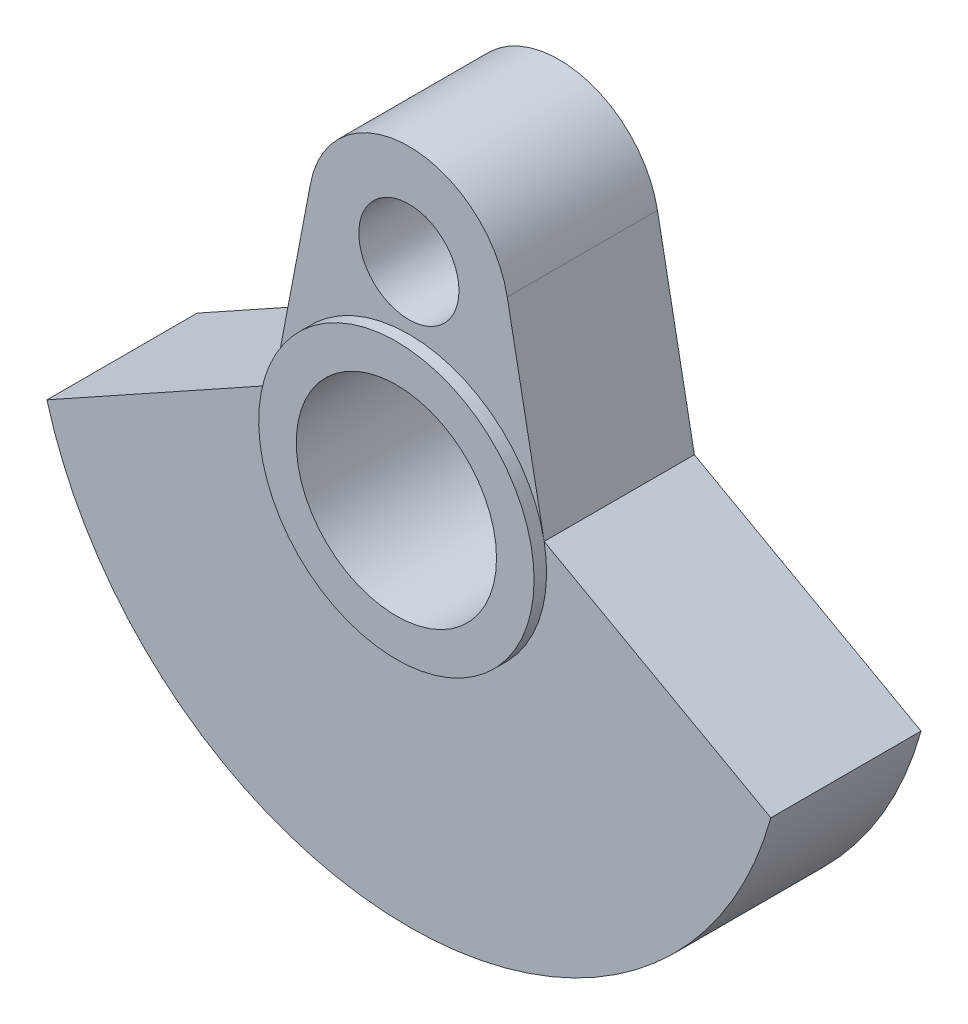
ISO-10303-21;
HEADER;
FILE_DESCRIPTION(('STEP AP214'),'2;1');
FILE_NAME('part.step','',(''),(''),'','','');
FILE_SCHEMA(('AUTOMOTIVE_DESIGN { 1 0 10303 214 1 1 1 1 }'));
ENDSEC;
DATA;
#1=APPLICATION_CONTEXT('core data for automotive mechanical design processes');
#2=APPLICATION_PROTOCOL_DEFINITION('international standard','automotive_design',2000,#1);
#3=PRODUCT_CONTEXT('',#1,'mechanical');
#4=PRODUCT('Part','Part','',(#3));
#5=PRODUCT_RELATED_PRODUCT_CATEGORY('part','',(#4));
#6=PRODUCT_DEFINITION_FORMATION('','',#4);
#7=PRODUCT_DEFINITION_CONTEXT('part definition',#1,'design');
#8=PRODUCT_DEFINITION('design','',#6,#7);
#9=PRODUCT_DEFINITION_SHAPE('','',#8);
#10=(LENGTH_UNIT() NAMED_UNIT(*) SI_UNIT(.MILLI.,.METRE.));
#11=(NAMED_UNIT(*) PLANE_ANGLE_UNIT() SI_UNIT($,.RADIAN.));
#12=(NAMED_UNIT(*) SI_UNIT($,.STERADIAN.) SOLID_ANGLE_UNIT());
#13=UNCERTAINTY_MEASURE_WITH_UNIT(LENGTH_MEASURE(1.E-05),#10,'distance_accuracy_value','');
#14=(GEOMETRIC_REPRESENTATION_CONTEXT(3) GLOBAL_UNCERTAINTY_ASSIGNED_CONTEXT((#13)) GLOBAL_UNIT_ASSIGNED_CONTEXT((#10,
#11,#12)) REPRESENTATION_CONTEXT('',''));
#15=CARTESIAN_POINT('',(0.,0.,0.));
#16=DIRECTION('',(0.,0.,1.));
#17=DIRECTION('',(1.,0.,0.));
#18=AXIS2_PLACEMENT_3D('',#15,#16,#17);
#19=CARTESIAN_POINT('',(0.,-8.,6.));
#20=DIRECTION('',(0.,0.,1.));
#21=DIRECTION('',(1.,0.,0.));
#22=AXIS2_PLACEMENT_3D('',#19,#20,#21);
#23=PLANE('',#22);
#24=CARTESIAN_POINT('',(0.,-8.,6.));
#25=DIRECTION('',(0.,0.,1.));
#26=DIRECTION('',(1.,0.,0.));
#27=AXIS2_PLACEMENT_3D('',#24,#25,#26);
#28=CIRCLE('',#27,5.5);
#29=CARTESIAN_POINT('',(5.40245531564121,-6.96875,6.));
#30=VERTEX_POINT('',#29);
#31=CARTESIAN_POINT('',(-5.40245531564121,-6.96875,6.));
#32=VERTEX_POINT('',#31);
#33=EDGE_CURVE('E54',#30,#32,#28,.T.);
#34=ORIENTED_EDGE('',*,*,#33,.F.);
#35=DIRECTION('',(-0.1875,0.982264602843857,0.));
#36=VECTOR('',#35,1.);
#37=CARTESIAN_POINT('',(5.40245531564121,-6.96875,6.));
#38=LINE('',#37,#36);
#39=CARTESIAN_POINT('',(3.92905841137543,0.75,6.));
#40=VERTEX_POINT('',#39);
#41=EDGE_CURVE('E116',#30,#40,#38,.T.);
#42=ORIENTED_EDGE('',*,*,#41,.T.);
#43=CARTESIAN_POINT('',(0.,0.,6.));
#44=DIRECTION('',(0.,0.,1.));
#45=DIRECTION('',(1.,0.,0.));
#46=AXIS2_PLACEMENT_3D('',#43,#44,#45);
#47=CIRCLE('',#46,4.);
#48=CARTESIAN_POINT('',(-3.92905841137543,0.75,6.));
#49=VERTEX_POINT('',#48);
#50=EDGE_CURVE('E109',#40,#49,#47,.T.);
#51=ORIENTED_EDGE('',*,*,#50,.T.);
#52=DIRECTION('',(-0.1875,-0.982264602843857,0.));
#53=VECTOR('',#52,1.);
#54=CARTESIAN_POINT('',(-5.40245531564121,-6.96875,6.));
#55=LINE('',#54,#53);
#56=EDGE_CURVE('E114',#49,#32,#55,.T.);
#57=ORIENTED_EDGE('',*,*,#56,.T.);
#58=EDGE_LOOP('',(#34,#42,#51,#57));
#59=FACE_BOUND('',#58,.T.);
#60=CARTESIAN_POINT('',(0.,0.,6.));
#61=DIRECTION('',(0.,0.,1.));
#62=DIRECTION('',(1.,0.,0.));
#63=AXIS2_PLACEMENT_3D('',#60,#61,#62);
#64=CIRCLE('',#63,2.);
#65=CARTESIAN_POINT('',(2.,0.,6.));
#66=VERTEX_POINT('',#65);
#67=EDGE_CURVE('E143',#66,#66,#64,.T.);
#68=ORIENTED_EDGE('',*,*,#67,.F.);
#69=EDGE_LOOP('',(#68));
#70=FACE_BOUND('',#69,.T.);
#71=ADVANCED_FACE('F42',(#59,#70),#23,.T.);
#72=EDGE_CURVE('E11',#32,#30,#28,.T.);
#73=ORIENTED_EDGE('',*,*,#72,.F.);
#74=DIRECTION('',(-0.874114625939399,-0.485719693567004,0.));
#75=VECTOR('',#74,1.);
#76=CARTESIAN_POINT('',(-5.40245531564121,-6.96875,6.));
#77=LINE('',#76,#75);
#78=CARTESIAN_POINT('',(-14.456832294801,-12.,6.));
#79=VERTEX_POINT('',#78);
#80=EDGE_CURVE('E62',#32,#79,#77,.T.);
#81=ORIENTED_EDGE('',*,*,#80,.T.);
#82=CARTESIAN_POINT('',(0.,-8.,6.));
#83=DIRECTION('',(0.,0.,1.));
#84=DIRECTION('',(1.,0.,0.));
#85=AXIS2_PLACEMENT_3D('',#82,#83,#84);
#86=CIRCLE('',#85,15.);
#87=CARTESIAN_POINT('',(14.456832294801,-12.,6.));
#88=VERTEX_POINT('',#87);
#89=EDGE_CURVE('E155',#79,#88,#86,.T.);
#90=ORIENTED_EDGE('',*,*,#89,.T.);
#91=DIRECTION('',(-0.874114625939399,0.485719693567004,0.));
#92=VECTOR('',#91,1.);
#93=CARTESIAN_POINT('',(5.40245531564121,-6.96875,6.));
#94=LINE('',#93,#92);
#95=EDGE_CURVE('E101',#88,#30,#94,.T.);
#96=ORIENTED_EDGE('',*,*,#95,.T.);
#97=EDGE_LOOP('',(#73,#81,#90,#96));
#98=FACE_BOUND('',#97,.T.);
#99=ADVANCED_FACE('F177',(#98),#23,.T.);
#100=CARTESIAN_POINT('',(0.,-8.,0.));
#101=DIRECTION('',(0.,0.,1.));
#102=DIRECTION('',(1.,0.,0.));
#103=AXIS2_PLACEMENT_3D('',#100,#101,#102);
#104=PLANE('',#103);
#105=CARTESIAN_POINT('',(0.,-8.,0.));
#106=DIRECTION('',(0.,0.,1.));
#107=DIRECTION('',(1.,0.,0.));
#108=AXIS2_PLACEMENT_3D('',#105,#106,#107);
#109=CIRCLE('',#108,15.);
#110=CARTESIAN_POINT('',(-14.456832294801,-12.,0.));
#111=VERTEX_POINT('',#110);
#112=CARTESIAN_POINT('',(14.456832294801,-12.,0.));
#113=VERTEX_POINT('',#112);
#114=EDGE_CURVE('E138',#111,#113,#109,.T.);
#115=ORIENTED_EDGE('',*,*,#114,.F.);
#116=DIRECTION('',(-0.874114625939399,-0.485719693567004,0.));
#117=VECTOR('',#116,1.);
#118=CARTESIAN_POINT('',(-5.40245531564121,-6.96875,0.));
#119=LINE('',#118,#117);
#120=CARTESIAN_POINT('',(-5.40245531564121,-6.96875,0.));
#121=VERTEX_POINT('',#120);
#122=EDGE_CURVE('E92',#121,#111,#119,.T.);
#123=ORIENTED_EDGE('',*,*,#122,.F.);
#124=DIRECTION('',(-0.1875,-0.982264602843857,0.));
#125=VECTOR('',#124,1.);
#126=CARTESIAN_POINT('',(-5.40245531564121,-6.96875,0.));
#127=LINE('',#126,#125);
#128=CARTESIAN_POINT('',(-3.92905841137543,0.75,0.));
#129=VERTEX_POINT('',#128);
#130=EDGE_CURVE('E86',#129,#121,#127,.T.);
#131=ORIENTED_EDGE('',*,*,#130,.F.);
#132=CARTESIAN_POINT('',(0.,0.,0.));
#133=DIRECTION('',(0.,0.,1.));
#134=DIRECTION('',(1.,0.,0.));
#135=AXIS2_PLACEMENT_3D('',#132,#133,#134);
#136=CIRCLE('',#135,4.);
#137=CARTESIAN_POINT('',(3.92905841137543,0.75,0.));
#138=VERTEX_POINT('',#137);
#139=EDGE_CURVE('E125',#138,#129,#136,.T.);
#140=ORIENTED_EDGE('',*,*,#139,.F.);
#141=DIRECTION('',(-0.1875,0.982264602843857,0.));
#142=VECTOR('',#141,1.);
#143=CARTESIAN_POINT('',(5.40245531564121,-6.96875,0.));
#144=LINE('',#143,#142);
#145=CARTESIAN_POINT('',(5.40245531564121,-6.96875,0.));
#146=VERTEX_POINT('',#145);
#147=EDGE_CURVE('E146',#146,#138,#144,.T.);
#148=ORIENTED_EDGE('',*,*,#147,.F.);
#149=DIRECTION('',(-0.874114625939399,0.485719693567004,0.));
#150=VECTOR('',#149,1.);
#151=CARTESIAN_POINT('',(5.40245531564121,-6.96875,0.));
#152=LINE('',#151,#150);
#153=EDGE_CURVE('E142',#113,#146,#152,.T.);
#154=ORIENTED_EDGE('',*,*,#153,.F.);
#155=EDGE_LOOP('',(#115,#123,#131,#140,#148,#154));
#156=FACE_BOUND('',#155,.T.);
#157=CARTESIAN_POINT('',(0.,0.,0.));
#158=DIRECTION('',(0.,0.,1.));
#159=DIRECTION('',(1.,0.,0.));
#160=AXIS2_PLACEMENT_3D('',#157,#158,#159);
#161=CIRCLE('',#160,2.);
#162=CARTESIAN_POINT('',(2.,0.,0.));
#163=VERTEX_POINT('',#162);
#164=EDGE_CURVE('E329',#163,#163,#161,.T.);
#165=ORIENTED_EDGE('',*,*,#164,.T.);
#166=EDGE_LOOP('',(#165));
#167=FACE_BOUND('',#166,.T.);
#168=CARTESIAN_POINT('',(0.,-8.,0.));
#169=DIRECTION('',(0.,0.,1.));
#170=DIRECTION('',(1.,0.,0.));
#171=AXIS2_PLACEMENT_3D('',#168,#169,#170);
#172=CIRCLE('',#171,4.);
#173=CARTESIAN_POINT('',(4.,-8.,0.));
#174=VERTEX_POINT('',#173);
#175=EDGE_CURVE('E331',#174,#174,#172,.T.);
#176=ORIENTED_EDGE('',*,*,#175,.T.);
#177=EDGE_LOOP('',(#176));
#178=FACE_BOUND('',#177,.T.);
#179=ADVANCED_FACE('F173',(#156,#167,#178),#104,.F.);
#180=CARTESIAN_POINT('',(0.,-8.,6.));
#181=DIRECTION('',(0.,0.,-1.));
#182=DIRECTION('',(-1.,0.,0.));
#183=AXIS2_PLACEMENT_3D('',#180,#181,#182);
#184=CYLINDRICAL_SURFACE('',#183,15.);
#185=ORIENTED_EDGE('',*,*,#114,.T.);
#186=DIRECTION('',(0.,0.,-1.));
#187=VECTOR('',#186,1.);
#188=CARTESIAN_POINT('',(14.456832294801,-12.,6.));
#189=LINE('',#188,#187);
#190=EDGE_CURVE('E46',#88,#113,#189,.T.);
#191=ORIENTED_EDGE('',*,*,#190,.F.);
#192=ORIENTED_EDGE('',*,*,#89,.F.);
#193=DIRECTION('',(0.,0.,-1.));
#194=VECTOR('',#193,1.);
#195=CARTESIAN_POINT('',(-14.456832294801,-12.,6.));
#196=LINE('',#195,#194);
#197=EDGE_CURVE('E134',#79,#111,#196,.T.);
#198=ORIENTED_EDGE('',*,*,#197,.T.);
#199=EDGE_LOOP('',(#185,#191,#192,#198));
#200=FACE_BOUND('',#199,.T.);
#201=ADVANCED_FACE('F44',(#200),#184,.T.);
#202=CARTESIAN_POINT('',(5.40245531564121,-6.96875,6.));
#203=DIRECTION('',(-0.485719693567004,-0.874114625939399,0.));
#204=DIRECTION('',(0.874114625939399,-0.485719693567004,0.));
#205=AXIS2_PLACEMENT_3D('',#202,#203,#204);
#206=PLANE('',#205);
#207=ORIENTED_EDGE('',*,*,#153,.T.);
#208=DIRECTION('',(0.,0.,-1.));
#209=VECTOR('',#208,1.);
#210=CARTESIAN_POINT('',(5.40245531564121,-6.96875,6.));
#211=LINE('',#210,#209);
#212=EDGE_CURVE('E161',#30,#146,#211,.T.);
#213=ORIENTED_EDGE('',*,*,#212,.F.);
#214=ORIENTED_EDGE('',*,*,#95,.F.);
#215=ORIENTED_EDGE('',*,*,#190,.T.);
#216=EDGE_LOOP('',(#207,#213,#214,#215));
#217=FACE_BOUND('',#216,.T.);
#218=ADVANCED_FACE('F168',(#217),#206,.F.);
#219=CARTESIAN_POINT('',(5.40245531564121,-6.96875,6.));
#220=DIRECTION('',(-0.982264602843857,-0.1875,0.));
#221=DIRECTION('',(0.1875,-0.982264602843857,0.));
#222=AXIS2_PLACEMENT_3D('',#219,#220,#221);
#223=PLANE('',#222);
#224=ORIENTED_EDGE('',*,*,#147,.T.);
#225=DIRECTION('',(0.,0.,-1.));
#226=VECTOR('',#225,1.);
#227=CARTESIAN_POINT('',(3.92905841137543,0.75,6.));
#228=LINE('',#227,#226);
#229=EDGE_CURVE('E127',#40,#138,#228,.T.);
#230=ORIENTED_EDGE('',*,*,#229,.F.);
#231=ORIENTED_EDGE('',*,*,#41,.F.);
#232=ORIENTED_EDGE('',*,*,#212,.T.);
#233=EDGE_LOOP('',(#224,#230,#231,#232));
#234=FACE_BOUND('',#233,.T.);
#235=ADVANCED_FACE('F175',(#234),#223,.F.);
#236=CARTESIAN_POINT('',(0.,0.,6.));
#237=DIRECTION('',(0.,0.,-1.));
#238=DIRECTION('',(-1.,0.,0.));
#239=AXIS2_PLACEMENT_3D('',#236,#237,#238);
#240=CYLINDRICAL_SURFACE('',#239,4.);
#241=ORIENTED_EDGE('',*,*,#139,.T.);
#242=DIRECTION('',(0.,0.,-1.));
#243=VECTOR('',#242,1.);
#244=CARTESIAN_POINT('',(-3.92905841137543,0.75,6.));
#245=LINE('',#244,#243);
#246=EDGE_CURVE('E122',#49,#129,#245,.T.);
#247=ORIENTED_EDGE('',*,*,#246,.F.);
#248=ORIENTED_EDGE('',*,*,#50,.F.);
#249=ORIENTED_EDGE('',*,*,#229,.T.);
#250=EDGE_LOOP('',(#241,#247,#248,#249));
#251=FACE_BOUND('',#250,.T.);
#252=ADVANCED_FACE('F123',(#251),#240,.T.);
#253=CARTESIAN_POINT('',(-5.40245531564121,-6.96875,6.));
#254=DIRECTION('',(0.982264602843857,-0.1875,0.));
#255=DIRECTION('',(0.1875,0.982264602843857,0.));
#256=AXIS2_PLACEMENT_3D('',#253,#254,#255);
#257=PLANE('',#256);
#258=ORIENTED_EDGE('',*,*,#130,.T.);
#259=DIRECTION('',(0.,0.,-1.));
#260=VECTOR('',#259,1.);
#261=CARTESIAN_POINT('',(-5.40245531564121,-6.96875,6.));
#262=LINE('',#261,#260);
#263=EDGE_CURVE('E128',#32,#121,#262,.T.);
#264=ORIENTED_EDGE('',*,*,#263,.F.);
#265=ORIENTED_EDGE('',*,*,#56,.F.);
#266=ORIENTED_EDGE('',*,*,#246,.T.);
#267=EDGE_LOOP('',(#258,#264,#265,#266));
#268=FACE_BOUND('',#267,.T.);
#269=ADVANCED_FACE('F130',(#268),#257,.F.);
#270=CARTESIAN_POINT('',(-5.40245531564121,-6.96875,6.));
#271=DIRECTION('',(0.485719693567004,-0.874114625939399,0.));
#272=DIRECTION('',(0.874114625939399,0.485719693567004,0.));
#273=AXIS2_PLACEMENT_3D('',#270,#271,#272);
#274=PLANE('',#273);
#275=ORIENTED_EDGE('',*,*,#122,.T.);
#276=ORIENTED_EDGE('',*,*,#197,.F.);
#277=ORIENTED_EDGE('',*,*,#80,.F.);
#278=ORIENTED_EDGE('',*,*,#263,.T.);
#279=EDGE_LOOP('',(#275,#276,#277,#278));
#280=FACE_BOUND('',#279,.T.);
#281=ADVANCED_FACE('F208',(#280),#274,.F.);
#282=CARTESIAN_POINT('',(0.,0.,6.));
#283=DIRECTION('',(0.,0.,-1.));
#284=DIRECTION('',(-1.,0.,0.));
#285=AXIS2_PLACEMENT_3D('',#282,#283,#284);
#286=CYLINDRICAL_SURFACE('',#285,2.);
#287=ORIENTED_EDGE('',*,*,#67,.T.);
#288=EDGE_LOOP('',(#287));
#289=FACE_BOUND('',#288,.T.);
#290=ORIENTED_EDGE('',*,*,#164,.F.);
#291=EDGE_LOOP('',(#290));
#292=FACE_BOUND('',#291,.T.);
#293=ADVANCED_FACE('F205',(#289,#292),#286,.F.);
#294=CARTESIAN_POINT('',(0.,-8.,6.));
#295=DIRECTION('',(0.,0.,-1.));
#296=DIRECTION('',(-1.,0.,0.));
#297=AXIS2_PLACEMENT_3D('',#294,#295,#296);
#298=CYLINDRICAL_SURFACE('',#297,4.);
#299=ORIENTED_EDGE('',*,*,#175,.F.);
#300=EDGE_LOOP('',(#299));
#301=FACE_BOUND('',#300,.T.);
#302=CARTESIAN_POINT('',(0.,-8.,6.5));
#303=DIRECTION('',(0.,0.,1.));
#304=DIRECTION('',(1.,0.,0.));
#305=AXIS2_PLACEMENT_3D('',#302,#303,#304);
#306=CIRCLE('',#305,4.);
#307=CARTESIAN_POINT('',(4.,-8.,6.5));
#308=VERTEX_POINT('',#307);
#309=EDGE_CURVE('E184',#308,#308,#306,.T.);
#310=ORIENTED_EDGE('',*,*,#309,.T.);
#311=EDGE_LOOP('',(#310));
#312=FACE_BOUND('',#311,.T.);
#313=ADVANCED_FACE('F193',(#301,#312),#298,.F.);
#314=CARTESIAN_POINT('',(0.,-8.,6.5));
#315=DIRECTION('',(0.,0.,1.));
#316=DIRECTION('',(1.,0.,0.));
#317=AXIS2_PLACEMENT_3D('',#314,#315,#316);
#318=PLANE('',#317);
#319=ORIENTED_EDGE('',*,*,#309,.F.);
#320=EDGE_LOOP('',(#319));
#321=FACE_BOUND('',#320,.T.);
#322=CARTESIAN_POINT('',(0.,-8.,6.5));
#323=DIRECTION('',(0.,0.,1.));
#324=DIRECTION('',(1.,0.,0.));
#325=AXIS2_PLACEMENT_3D('',#322,#323,#324);
#326=CIRCLE('',#325,5.5);
#327=CARTESIAN_POINT('',(5.5,-8.,6.5));
#328=VERTEX_POINT('',#327);
#329=EDGE_CURVE('E183',#328,#328,#326,.T.);
#330=ORIENTED_EDGE('',*,*,#329,.T.);
#331=EDGE_LOOP('',(#330));
#332=FACE_BOUND('',#331,.T.);
#333=ADVANCED_FACE('F187',(#321,#332),#318,.T.);
#334=CARTESIAN_POINT('',(0.,-8.,6.5));
#335=DIRECTION('',(0.,0.,-1.));
#336=DIRECTION('',(-1.,0.,0.));
#337=AXIS2_PLACEMENT_3D('',#334,#335,#336);
#338=CYLINDRICAL_SURFACE('',#337,5.5);
#339=ORIENTED_EDGE('',*,*,#329,.F.);
#340=EDGE_LOOP('',(#339));
#341=FACE_BOUND('',#340,.T.);
#342=ORIENTED_EDGE('',*,*,#33,.T.);
#343=ORIENTED_EDGE('',*,*,#72,.T.);
#344=EDGE_LOOP('',(#342,#343));
#345=FACE_BOUND('',#344,.T.);
#346=ADVANCED_FACE('F185',(#341,#345),#338,.T.);
#347=CLOSED_SHELL('',(#71,#99,#179,#201,#218,#235,#252,#269,#281,#293,#313,#333,#346));
#348=MANIFOLD_SOLID_BREP('B2',#347);
#349=ADVANCED_BREP_SHAPE_REPRESENTATION('',(#18,#348),#14);
#350=SHAPE_DEFINITION_REPRESENTATION(#9,#349);
ENDSEC;
END-ISO-10303-21;
